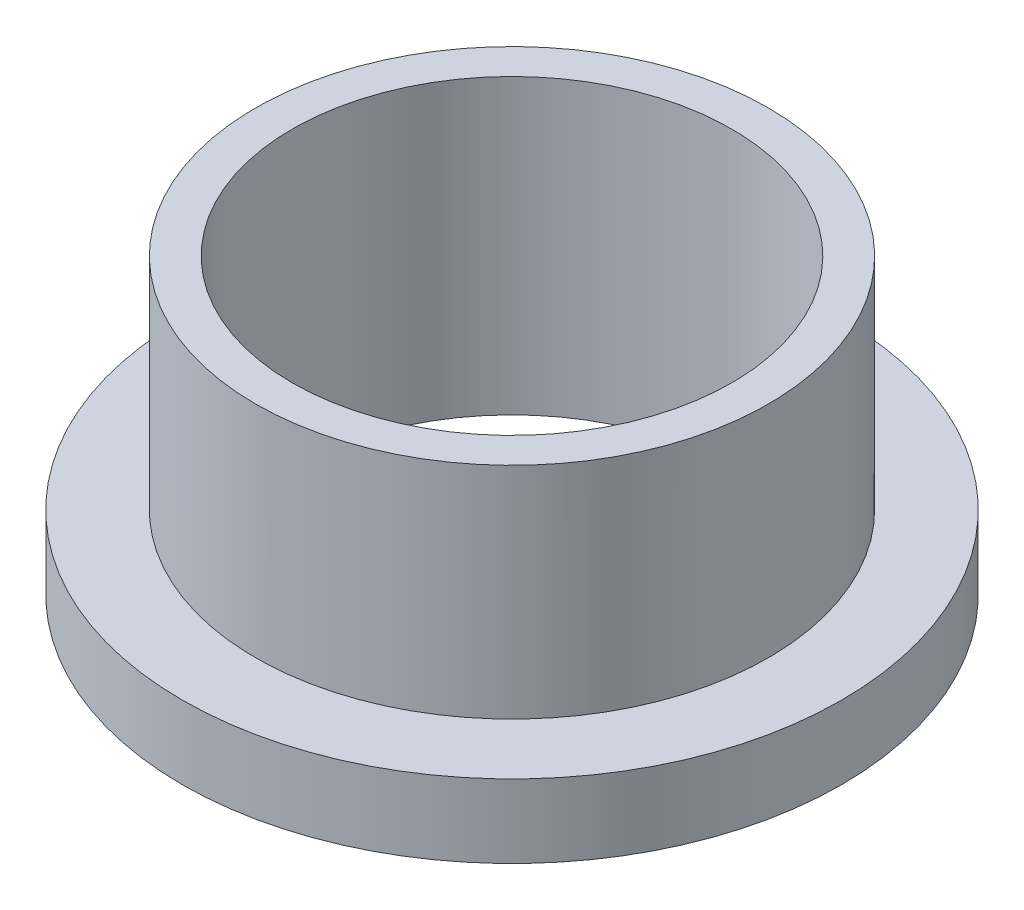
ISO-10303-21;
HEADER;
FILE_DESCRIPTION(('STEP AP214'),'2;1');
FILE_NAME('part.step','',(''),(''),'','','');
FILE_SCHEMA(('AUTOMOTIVE_DESIGN { 1 0 10303 214 1 1 1 1 }'));
ENDSEC;
DATA;
#1=APPLICATION_CONTEXT('core data for automotive mechanical design processes');
#2=APPLICATION_PROTOCOL_DEFINITION('international standard','automotive_design',2000,#1);
#3=PRODUCT_CONTEXT('',#1,'mechanical');
#4=PRODUCT('Part','Part','',(#3));
#5=PRODUCT_RELATED_PRODUCT_CATEGORY('part','',(#4));
#6=PRODUCT_DEFINITION_FORMATION('','',#4);
#7=PRODUCT_DEFINITION_CONTEXT('part definition',#1,'design');
#8=PRODUCT_DEFINITION('design','',#6,#7);
#9=PRODUCT_DEFINITION_SHAPE('','',#8);
#10=(LENGTH_UNIT() NAMED_UNIT(*) SI_UNIT(.MILLI.,.METRE.));
#11=(NAMED_UNIT(*) PLANE_ANGLE_UNIT() SI_UNIT($,.RADIAN.));
#12=(NAMED_UNIT(*) SI_UNIT($,.STERADIAN.) SOLID_ANGLE_UNIT());
#13=UNCERTAINTY_MEASURE_WITH_UNIT(LENGTH_MEASURE(1.E-05),#10,'distance_accuracy_value','');
#14=(GEOMETRIC_REPRESENTATION_CONTEXT(3) GLOBAL_UNCERTAINTY_ASSIGNED_CONTEXT((#13)) GLOBAL_UNIT_ASSIGNED_CONTEXT((#10,
#11,#12)) REPRESENTATION_CONTEXT('',''));
#15=CARTESIAN_POINT('',(0.,0.,0.));
#16=DIRECTION('',(0.,0.,1.));
#17=DIRECTION('',(1.,0.,0.));
#18=AXIS2_PLACEMENT_3D('',#15,#16,#17);
#19=CARTESIAN_POINT('',(0.,12.7,0.));
#20=DIRECTION('',(0.,-1.,0.));
#21=DIRECTION('',(0.,0.,-1.));
#22=AXIS2_PLACEMENT_3D('',#19,#20,#21);
#23=CYLINDRICAL_SURFACE('',#22,11.1125);
#24=CARTESIAN_POINT('',(0.,12.7,0.));
#25=DIRECTION('',(0.,1.,0.));
#26=DIRECTION('',(0.,0.,1.));
#27=AXIS2_PLACEMENT_3D('',#24,#25,#26);
#28=CIRCLE('',#27,11.1125);
#29=CARTESIAN_POINT('',(0.,12.7,11.1125));
#30=VERTEX_POINT('',#29);
#31=EDGE_CURVE('E38',#30,#30,#28,.T.);
#32=ORIENTED_EDGE('',*,*,#31,.F.);
#33=EDGE_LOOP('',(#32));
#34=FACE_BOUND('',#33,.T.);
#35=CARTESIAN_POINT('',(0.,3.175,0.));
#36=DIRECTION('',(0.,-1.,0.));
#37=DIRECTION('',(0.,0.,-1.));
#38=AXIS2_PLACEMENT_3D('',#35,#36,#37);
#39=CIRCLE('',#38,11.1125);
#40=CARTESIAN_POINT('',(0.,3.175,-11.1125));
#41=VERTEX_POINT('',#40);
#42=EDGE_CURVE('E10',#41,#41,#39,.T.);
#43=ORIENTED_EDGE('',*,*,#42,.F.);
#44=EDGE_LOOP('',(#43));
#45=FACE_BOUND('',#44,.T.);
#46=ADVANCED_FACE('F32',(#34,#45),#23,.T.);
#47=CARTESIAN_POINT('',(0.,12.7,0.));
#48=DIRECTION('',(0.,1.,0.));
#49=DIRECTION('',(0.,0.,1.));
#50=AXIS2_PLACEMENT_3D('',#47,#48,#49);
#51=PLANE('',#50);
#52=ORIENTED_EDGE('',*,*,#31,.T.);
#53=EDGE_LOOP('',(#52));
#54=FACE_BOUND('',#53,.T.);
#55=CARTESIAN_POINT('',(0.,12.7,0.));
#56=DIRECTION('',(0.,1.,0.));
#57=DIRECTION('',(0.,0.,1.));
#58=AXIS2_PLACEMENT_3D('',#55,#56,#57);
#59=CIRCLE('',#58,9.525);
#60=CARTESIAN_POINT('',(0.,12.7,9.525));
#61=VERTEX_POINT('',#60);
#62=EDGE_CURVE('E42',#61,#61,#59,.T.);
#63=ORIENTED_EDGE('',*,*,#62,.F.);
#64=EDGE_LOOP('',(#63));
#65=FACE_BOUND('',#64,.T.);
#66=ADVANCED_FACE('F70',(#54,#65),#51,.T.);
#67=CARTESIAN_POINT('',(0.,0.,0.));
#68=DIRECTION('',(0.,1.,0.));
#69=DIRECTION('',(0.,0.,1.));
#70=AXIS2_PLACEMENT_3D('',#67,#68,#69);
#71=PLANE('',#70);
#72=CARTESIAN_POINT('',(0.,0.,0.));
#73=DIRECTION('',(0.,1.,0.));
#74=DIRECTION('',(0.,0.,1.));
#75=AXIS2_PLACEMENT_3D('',#72,#73,#74);
#76=CIRCLE('',#75,9.525);
#77=CARTESIAN_POINT('',(0.,0.,9.525));
#78=VERTEX_POINT('',#77);
#79=EDGE_CURVE('E46',#78,#78,#76,.T.);
#80=ORIENTED_EDGE('',*,*,#79,.T.);
#81=EDGE_LOOP('',(#80));
#82=FACE_BOUND('',#81,.T.);
#83=CARTESIAN_POINT('',(0.,0.,0.));
#84=DIRECTION('',(0.,-1.,0.));
#85=DIRECTION('',(0.,0.,-1.));
#86=AXIS2_PLACEMENT_3D('',#83,#84,#85);
#87=CIRCLE('',#86,14.2875);
#88=CARTESIAN_POINT('',(0.,0.,-14.2875));
#89=VERTEX_POINT('',#88);
#90=EDGE_CURVE('E52',#89,#89,#87,.T.);
#91=ORIENTED_EDGE('',*,*,#90,.T.);
#92=EDGE_LOOP('',(#91));
#93=FACE_BOUND('',#92,.T.);
#94=ADVANCED_FACE('F75',(#82,#93),#71,.F.);
#95=CARTESIAN_POINT('',(0.,12.7,0.));
#96=DIRECTION('',(0.,-1.,0.));
#97=DIRECTION('',(0.,0.,-1.));
#98=AXIS2_PLACEMENT_3D('',#95,#96,#97);
#99=CYLINDRICAL_SURFACE('',#98,9.525);
#100=ORIENTED_EDGE('',*,*,#62,.T.);
#101=EDGE_LOOP('',(#100));
#102=FACE_BOUND('',#101,.T.);
#103=ORIENTED_EDGE('',*,*,#79,.F.);
#104=EDGE_LOOP('',(#103));
#105=FACE_BOUND('',#104,.T.);
#106=ADVANCED_FACE('F67',(#102,#105),#99,.F.);
#107=CARTESIAN_POINT('',(0.,3.175,0.));
#108=DIRECTION('',(0.,-1.,0.));
#109=DIRECTION('',(0.,0.,-1.));
#110=AXIS2_PLACEMENT_3D('',#107,#108,#109);
#111=CYLINDRICAL_SURFACE('',#110,14.2875);
#112=CARTESIAN_POINT('',(0.,3.175,0.));
#113=DIRECTION('',(0.,-1.,0.));
#114=DIRECTION('',(0.,0.,-1.));
#115=AXIS2_PLACEMENT_3D('',#112,#113,#114);
#116=CIRCLE('',#115,14.2875);
#117=CARTESIAN_POINT('',(0.,3.175,-14.2875));
#118=VERTEX_POINT('',#117);
#119=EDGE_CURVE('E50',#118,#118,#116,.T.);
#120=ORIENTED_EDGE('',*,*,#119,.T.);
#121=EDGE_LOOP('',(#120));
#122=FACE_BOUND('',#121,.T.);
#123=ORIENTED_EDGE('',*,*,#90,.F.);
#124=EDGE_LOOP('',(#123));
#125=FACE_BOUND('',#124,.T.);
#126=ADVANCED_FACE('F58',(#122,#125),#111,.T.);
#127=CARTESIAN_POINT('',(0.,3.175,0.));
#128=DIRECTION('',(0.,-1.,0.));
#129=DIRECTION('',(0.,0.,-1.));
#130=AXIS2_PLACEMENT_3D('',#127,#128,#129);
#131=PLANE('',#130);
#132=ORIENTED_EDGE('',*,*,#42,.T.);
#133=EDGE_LOOP('',(#132));
#134=FACE_BOUND('',#133,.T.);
#135=ORIENTED_EDGE('',*,*,#119,.F.);
#136=EDGE_LOOP('',(#135));
#137=FACE_BOUND('',#136,.T.);
#138=ADVANCED_FACE('F61',(#134,#137),#131,.F.);
#139=CLOSED_SHELL('',(#46,#66,#94,#106,#126,#138));
#140=MANIFOLD_SOLID_BREP('B2',#139);
#141=ADVANCED_BREP_SHAPE_REPRESENTATION('',(#18,#140),#14);
#142=SHAPE_DEFINITION_REPRESENTATION(#9,#141);
ENDSEC;
END-ISO-10303-21;
